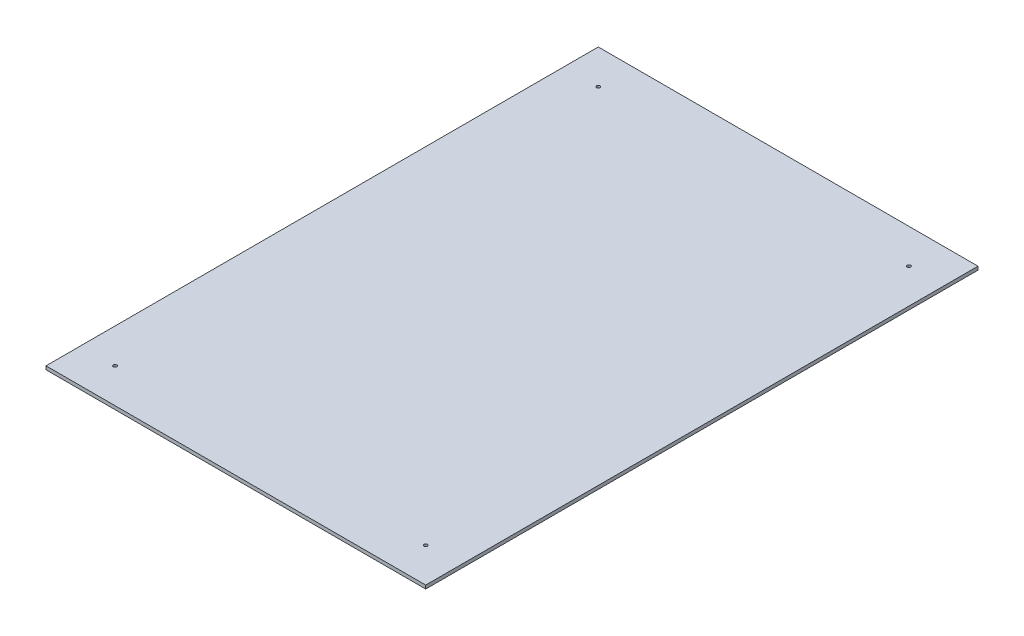
ISO-10303-21;
HEADER;
FILE_DESCRIPTION(('STEP AP214'),'2;1');
FILE_NAME('part.step','',(''),(''),'','','');
FILE_SCHEMA(('AUTOMOTIVE_DESIGN { 1 0 10303 214 1 1 1 1 }'));
ENDSEC;
DATA;
#1=APPLICATION_CONTEXT('core data for automotive mechanical design processes');
#2=APPLICATION_PROTOCOL_DEFINITION('international standard','automotive_design',2000,#1);
#3=PRODUCT_CONTEXT('',#1,'mechanical');
#4=PRODUCT('Part','Part','',(#3));
#5=PRODUCT_RELATED_PRODUCT_CATEGORY('part','',(#4));
#6=PRODUCT_DEFINITION_FORMATION('','',#4);
#7=PRODUCT_DEFINITION_CONTEXT('part definition',#1,'design');
#8=PRODUCT_DEFINITION('design','',#6,#7);
#9=PRODUCT_DEFINITION_SHAPE('','',#8);
#10=(LENGTH_UNIT() NAMED_UNIT(*) SI_UNIT(.MILLI.,.METRE.));
#11=(NAMED_UNIT(*) PLANE_ANGLE_UNIT() SI_UNIT($,.RADIAN.));
#12=(NAMED_UNIT(*) SI_UNIT($,.STERADIAN.) SOLID_ANGLE_UNIT());
#13=UNCERTAINTY_MEASURE_WITH_UNIT(LENGTH_MEASURE(1.E-05),#10,'distance_accuracy_value','');
#14=(GEOMETRIC_REPRESENTATION_CONTEXT(3) GLOBAL_UNCERTAINTY_ASSIGNED_CONTEXT((#13)) GLOBAL_UNIT_ASSIGNED_CONTEXT((#10,
#11,#12)) REPRESENTATION_CONTEXT('',''));
#15=CARTESIAN_POINT('',(0.,0.,0.));
#16=DIRECTION('',(0.,0.,1.));
#17=DIRECTION('',(1.,0.,0.));
#18=AXIS2_PLACEMENT_3D('',#15,#16,#17);
#19=CARTESIAN_POINT('',(0.,0.,0.));
#20=DIRECTION('',(0.,-1.,0.));
#21=DIRECTION('',(0.,0.,-1.));
#22=AXIS2_PLACEMENT_3D('',#19,#20,#21);
#23=PLANE('',#22);
#24=DIRECTION('',(0.,0.,-1.));
#25=VECTOR('',#24,1.);
#26=CARTESIAN_POINT('',(275.,0.,400.));
#27=LINE('',#26,#25);
#28=CARTESIAN_POINT('',(275.,0.,400.));
#29=VERTEX_POINT('',#28);
#30=CARTESIAN_POINT('',(275.,0.,-400.));
#31=VERTEX_POINT('',#30);
#32=EDGE_CURVE('E98',#29,#31,#27,.T.);
#33=ORIENTED_EDGE('',*,*,#32,.F.);
#34=DIRECTION('',(1.,0.,0.));
#35=VECTOR('',#34,1.);
#36=CARTESIAN_POINT('',(-275.,0.,400.));
#37=LINE('',#36,#35);
#38=CARTESIAN_POINT('',(-275.,0.,400.));
#39=VERTEX_POINT('',#38);
#40=EDGE_CURVE('E74',#39,#29,#37,.T.);
#41=ORIENTED_EDGE('',*,*,#40,.F.);
#42=DIRECTION('',(0.,0.,1.));
#43=VECTOR('',#42,1.);
#44=CARTESIAN_POINT('',(-275.,0.,400.));
#45=LINE('',#44,#43);
#46=CARTESIAN_POINT('',(-275.,0.,-400.));
#47=VERTEX_POINT('',#46);
#48=EDGE_CURVE('E68',#47,#39,#45,.T.);
#49=ORIENTED_EDGE('',*,*,#48,.F.);
#50=DIRECTION('',(-1.,0.,0.));
#51=VECTOR('',#50,1.);
#52=CARTESIAN_POINT('',(-275.,0.,-400.));
#53=LINE('',#52,#51);
#54=EDGE_CURVE('E90',#31,#47,#53,.T.);
#55=ORIENTED_EDGE('',*,*,#54,.F.);
#56=EDGE_LOOP('',(#33,#41,#49,#55));
#57=FACE_BOUND('',#56,.T.);
#58=CARTESIAN_POINT('',(225.,0.,350.));
#59=DIRECTION('',(0.,1.,0.));
#60=DIRECTION('',(0.,0.,1.));
#61=AXIS2_PLACEMENT_3D('',#58,#59,#60);
#62=CIRCLE('',#61,2.5);
#63=CARTESIAN_POINT('',(225.,0.,352.5));
#64=VERTEX_POINT('',#63);
#65=EDGE_CURVE('E101',#64,#64,#62,.T.);
#66=ORIENTED_EDGE('',*,*,#65,.T.);
#67=EDGE_LOOP('',(#66));
#68=FACE_BOUND('',#67,.T.);
#69=CARTESIAN_POINT('',(-225.,0.,350.));
#70=DIRECTION('',(0.,1.,0.));
#71=DIRECTION('',(0.,0.,1.));
#72=AXIS2_PLACEMENT_3D('',#69,#70,#71);
#73=CIRCLE('',#72,2.5);
#74=CARTESIAN_POINT('',(-225.,0.,352.5));
#75=VERTEX_POINT('',#74);
#76=EDGE_CURVE('E117',#75,#75,#73,.T.);
#77=ORIENTED_EDGE('',*,*,#76,.T.);
#78=EDGE_LOOP('',(#77));
#79=FACE_BOUND('',#78,.T.);
#80=CARTESIAN_POINT('',(225.,0.,-350.));
#81=DIRECTION('',(0.,1.,0.));
#82=DIRECTION('',(0.,0.,1.));
#83=AXIS2_PLACEMENT_3D('',#80,#81,#82);
#84=CIRCLE('',#83,2.5);
#85=CARTESIAN_POINT('',(225.,0.,-347.5));
#86=VERTEX_POINT('',#85);
#87=EDGE_CURVE('E123',#86,#86,#84,.T.);
#88=ORIENTED_EDGE('',*,*,#87,.T.);
#89=EDGE_LOOP('',(#88));
#90=FACE_BOUND('',#89,.T.);
#91=CARTESIAN_POINT('',(-225.,0.,-350.));
#92=DIRECTION('',(0.,1.,0.));
#93=DIRECTION('',(0.,0.,1.));
#94=AXIS2_PLACEMENT_3D('',#91,#92,#93);
#95=CIRCLE('',#94,2.5);
#96=CARTESIAN_POINT('',(-225.,0.,-347.5));
#97=VERTEX_POINT('',#96);
#98=EDGE_CURVE('E129',#97,#97,#95,.T.);
#99=ORIENTED_EDGE('',*,*,#98,.T.);
#100=EDGE_LOOP('',(#99));
#101=FACE_BOUND('',#100,.T.);
#102=ADVANCED_FACE('F34',(#57,#68,#79,#90,#101),#23,.T.);
#103=CARTESIAN_POINT('',(275.,5.,400.));
#104=DIRECTION('',(-1.,0.,0.));
#105=DIRECTION('',(0.,0.,1.));
#106=AXIS2_PLACEMENT_3D('',#103,#104,#105);
#107=PLANE('',#106);
#108=ORIENTED_EDGE('',*,*,#32,.T.);
#109=DIRECTION('',(0.,-1.,0.));
#110=VECTOR('',#109,1.);
#111=CARTESIAN_POINT('',(275.,5.,-400.));
#112=LINE('',#111,#110);
#113=CARTESIAN_POINT('',(275.,5.,-400.));
#114=VERTEX_POINT('',#113);
#115=EDGE_CURVE('E11',#114,#31,#112,.T.);
#116=ORIENTED_EDGE('',*,*,#115,.F.);
#117=DIRECTION('',(0.,0.,-1.));
#118=VECTOR('',#117,1.);
#119=CARTESIAN_POINT('',(275.,5.,400.));
#120=LINE('',#119,#118);
#121=CARTESIAN_POINT('',(275.,5.,400.));
#122=VERTEX_POINT('',#121);
#123=EDGE_CURVE('E86',#122,#114,#120,.T.);
#124=ORIENTED_EDGE('',*,*,#123,.F.);
#125=DIRECTION('',(0.,-1.,0.));
#126=VECTOR('',#125,1.);
#127=CARTESIAN_POINT('',(275.,5.,400.));
#128=LINE('',#127,#126);
#129=EDGE_CURVE('E94',#122,#29,#128,.T.);
#130=ORIENTED_EDGE('',*,*,#129,.T.);
#131=EDGE_LOOP('',(#108,#116,#124,#130));
#132=FACE_BOUND('',#131,.T.);
#133=ADVANCED_FACE('F36',(#132),#107,.F.);
#134=CARTESIAN_POINT('',(-275.,5.,-400.));
#135=DIRECTION('',(0.,0.,1.));
#136=DIRECTION('',(1.,0.,0.));
#137=AXIS2_PLACEMENT_3D('',#134,#135,#136);
#138=PLANE('',#137);
#139=ORIENTED_EDGE('',*,*,#54,.T.);
#140=DIRECTION('',(0.,-1.,0.));
#141=VECTOR('',#140,1.);
#142=CARTESIAN_POINT('',(-275.,5.,-400.));
#143=LINE('',#142,#141);
#144=CARTESIAN_POINT('',(-275.,5.,-400.));
#145=VERTEX_POINT('',#144);
#146=EDGE_CURVE('E43',#145,#47,#143,.T.);
#147=ORIENTED_EDGE('',*,*,#146,.F.);
#148=DIRECTION('',(-1.,0.,0.));
#149=VECTOR('',#148,1.);
#150=CARTESIAN_POINT('',(-275.,5.,-400.));
#151=LINE('',#150,#149);
#152=EDGE_CURVE('E81',#114,#145,#151,.T.);
#153=ORIENTED_EDGE('',*,*,#152,.F.);
#154=ORIENTED_EDGE('',*,*,#115,.T.);
#155=EDGE_LOOP('',(#139,#147,#153,#154));
#156=FACE_BOUND('',#155,.T.);
#157=ADVANCED_FACE('F89',(#156),#138,.F.);
#158=CARTESIAN_POINT('',(-275.,5.,400.));
#159=DIRECTION('',(1.,0.,0.));
#160=DIRECTION('',(0.,0.,-1.));
#161=AXIS2_PLACEMENT_3D('',#158,#159,#160);
#162=PLANE('',#161);
#163=ORIENTED_EDGE('',*,*,#48,.T.);
#164=DIRECTION('',(0.,-1.,0.));
#165=VECTOR('',#164,1.);
#166=CARTESIAN_POINT('',(-275.,5.,400.));
#167=LINE('',#166,#165);
#168=CARTESIAN_POINT('',(-275.,5.,400.));
#169=VERTEX_POINT('',#168);
#170=EDGE_CURVE('E91',#169,#39,#167,.T.);
#171=ORIENTED_EDGE('',*,*,#170,.F.);
#172=DIRECTION('',(0.,0.,1.));
#173=VECTOR('',#172,1.);
#174=CARTESIAN_POINT('',(-275.,5.,400.));
#175=LINE('',#174,#173);
#176=EDGE_CURVE('E84',#145,#169,#175,.T.);
#177=ORIENTED_EDGE('',*,*,#176,.F.);
#178=ORIENTED_EDGE('',*,*,#146,.T.);
#179=EDGE_LOOP('',(#163,#171,#177,#178));
#180=FACE_BOUND('',#179,.T.);
#181=ADVANCED_FACE('F92',(#180),#162,.F.);
#182=CARTESIAN_POINT('',(-275.,5.,400.));
#183=DIRECTION('',(0.,0.,-1.));
#184=DIRECTION('',(-1.,0.,0.));
#185=AXIS2_PLACEMENT_3D('',#182,#183,#184);
#186=PLANE('',#185);
#187=ORIENTED_EDGE('',*,*,#40,.T.);
#188=ORIENTED_EDGE('',*,*,#129,.F.);
#189=DIRECTION('',(1.,0.,0.));
#190=VECTOR('',#189,1.);
#191=CARTESIAN_POINT('',(-275.,5.,400.));
#192=LINE('',#191,#190);
#193=EDGE_CURVE('E51',#169,#122,#192,.T.);
#194=ORIENTED_EDGE('',*,*,#193,.F.);
#195=ORIENTED_EDGE('',*,*,#170,.T.);
#196=EDGE_LOOP('',(#187,#188,#194,#195));
#197=FACE_BOUND('',#196,.T.);
#198=ADVANCED_FACE('F106',(#197),#186,.F.);
#199=CARTESIAN_POINT('',(0.,5.,0.));
#200=DIRECTION('',(0.,-1.,0.));
#201=DIRECTION('',(0.,0.,-1.));
#202=AXIS2_PLACEMENT_3D('',#199,#200,#201);
#203=PLANE('',#202);
#204=CARTESIAN_POINT('',(-225.,5.,-350.));
#205=DIRECTION('',(0.,1.,0.));
#206=DIRECTION('',(0.,0.,1.));
#207=AXIS2_PLACEMENT_3D('',#204,#205,#206);
#208=CIRCLE('',#207,2.5);
#209=CARTESIAN_POINT('',(-225.,5.,-347.5));
#210=VERTEX_POINT('',#209);
#211=EDGE_CURVE('E132',#210,#210,#208,.T.);
#212=ORIENTED_EDGE('',*,*,#211,.F.);
#213=EDGE_LOOP('',(#212));
#214=FACE_BOUND('',#213,.T.);
#215=CARTESIAN_POINT('',(225.,5.,-350.));
#216=DIRECTION('',(0.,1.,0.));
#217=DIRECTION('',(0.,0.,1.));
#218=AXIS2_PLACEMENT_3D('',#215,#216,#217);
#219=CIRCLE('',#218,2.5);
#220=CARTESIAN_POINT('',(225.,5.,-347.5));
#221=VERTEX_POINT('',#220);
#222=EDGE_CURVE('E126',#221,#221,#219,.T.);
#223=ORIENTED_EDGE('',*,*,#222,.F.);
#224=EDGE_LOOP('',(#223));
#225=FACE_BOUND('',#224,.T.);
#226=CARTESIAN_POINT('',(-225.,5.,350.));
#227=DIRECTION('',(0.,1.,0.));
#228=DIRECTION('',(0.,0.,1.));
#229=AXIS2_PLACEMENT_3D('',#226,#227,#228);
#230=CIRCLE('',#229,2.5);
#231=CARTESIAN_POINT('',(-225.,5.,352.5));
#232=VERTEX_POINT('',#231);
#233=EDGE_CURVE('E120',#232,#232,#230,.T.);
#234=ORIENTED_EDGE('',*,*,#233,.F.);
#235=EDGE_LOOP('',(#234));
#236=FACE_BOUND('',#235,.T.);
#237=CARTESIAN_POINT('',(225.,5.,350.));
#238=DIRECTION('',(0.,1.,0.));
#239=DIRECTION('',(0.,0.,1.));
#240=AXIS2_PLACEMENT_3D('',#237,#238,#239);
#241=CIRCLE('',#240,2.5);
#242=CARTESIAN_POINT('',(225.,5.,352.5));
#243=VERTEX_POINT('',#242);
#244=EDGE_CURVE('E114',#243,#243,#241,.T.);
#245=ORIENTED_EDGE('',*,*,#244,.F.);
#246=EDGE_LOOP('',(#245));
#247=FACE_BOUND('',#246,.T.);
#248=ORIENTED_EDGE('',*,*,#123,.T.);
#249=ORIENTED_EDGE('',*,*,#152,.T.);
#250=ORIENTED_EDGE('',*,*,#176,.T.);
#251=ORIENTED_EDGE('',*,*,#193,.T.);
#252=EDGE_LOOP('',(#248,#249,#250,#251));
#253=FACE_BOUND('',#252,.T.);
#254=ADVANCED_FACE('F82',(#214,#225,#236,#247,#253),#203,.F.);
#255=CARTESIAN_POINT('',(225.,5.,350.));
#256=DIRECTION('',(0.,1.,0.));
#257=DIRECTION('',(0.,0.,1.));
#258=AXIS2_PLACEMENT_3D('',#255,#256,#257);
#259=CYLINDRICAL_SURFACE('',#258,2.5);
#260=ORIENTED_EDGE('',*,*,#65,.F.);
#261=EDGE_LOOP('',(#260));
#262=FACE_BOUND('',#261,.T.);
#263=ORIENTED_EDGE('',*,*,#244,.T.);
#264=EDGE_LOOP('',(#263));
#265=FACE_BOUND('',#264,.T.);
#266=ADVANCED_FACE('F140',(#262,#265),#259,.F.);
#267=CARTESIAN_POINT('',(-225.,5.,350.));
#268=DIRECTION('',(0.,1.,0.));
#269=DIRECTION('',(0.,0.,1.));
#270=AXIS2_PLACEMENT_3D('',#267,#268,#269);
#271=CYLINDRICAL_SURFACE('',#270,2.5);
#272=ORIENTED_EDGE('',*,*,#76,.F.);
#273=EDGE_LOOP('',(#272));
#274=FACE_BOUND('',#273,.T.);
#275=ORIENTED_EDGE('',*,*,#233,.T.);
#276=EDGE_LOOP('',(#275));
#277=FACE_BOUND('',#276,.T.);
#278=ADVANCED_FACE('F149',(#274,#277),#271,.F.);
#279=CARTESIAN_POINT('',(225.,5.,-350.));
#280=DIRECTION('',(0.,1.,0.));
#281=DIRECTION('',(0.,0.,1.));
#282=AXIS2_PLACEMENT_3D('',#279,#280,#281);
#283=CYLINDRICAL_SURFACE('',#282,2.5);
#284=ORIENTED_EDGE('',*,*,#87,.F.);
#285=EDGE_LOOP('',(#284));
#286=FACE_BOUND('',#285,.T.);
#287=ORIENTED_EDGE('',*,*,#222,.T.);
#288=EDGE_LOOP('',(#287));
#289=FACE_BOUND('',#288,.T.);
#290=ADVANCED_FACE('F155',(#286,#289),#283,.F.);
#291=CARTESIAN_POINT('',(-225.,5.,-350.));
#292=DIRECTION('',(0.,1.,0.));
#293=DIRECTION('',(0.,0.,1.));
#294=AXIS2_PLACEMENT_3D('',#291,#292,#293);
#295=CYLINDRICAL_SURFACE('',#294,2.5);
#296=ORIENTED_EDGE('',*,*,#98,.F.);
#297=EDGE_LOOP('',(#296));
#298=FACE_BOUND('',#297,.T.);
#299=ORIENTED_EDGE('',*,*,#211,.T.);
#300=EDGE_LOOP('',(#299));
#301=FACE_BOUND('',#300,.T.);
#302=ADVANCED_FACE('F136',(#298,#301),#295,.F.);
#303=CLOSED_SHELL('',(#102,#133,#157,#181,#198,#254,#266,#278,#290,#302));
#304=MANIFOLD_SOLID_BREP('B2',#303);
#305=ADVANCED_BREP_SHAPE_REPRESENTATION('',(#18,#304),#14);
#306=SHAPE_DEFINITION_REPRESENTATION(#9,#305);
ENDSEC;
END-ISO-10303-21;
